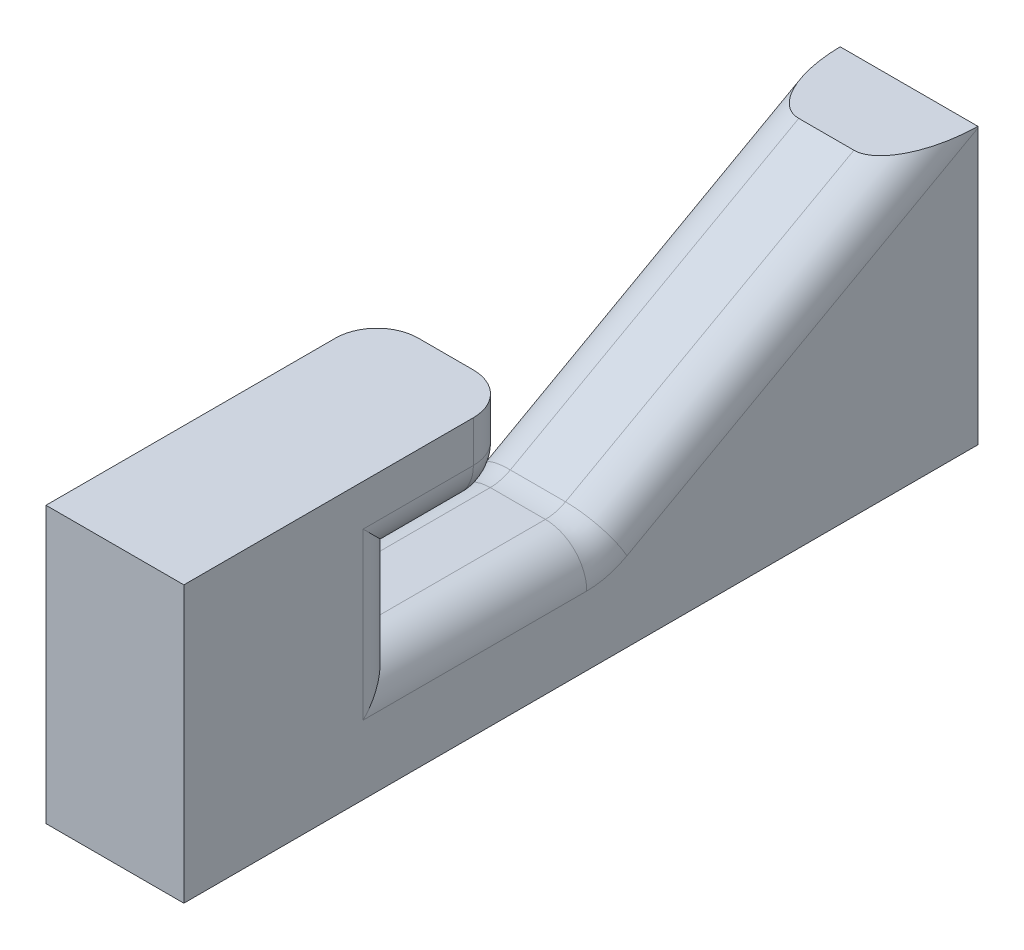
ISO-10303-21;
HEADER;
FILE_DESCRIPTION(('STEP AP214'),'2;1');
FILE_NAME('part.step','',(''),(''),'','','');
FILE_SCHEMA(('AUTOMOTIVE_DESIGN { 1 0 10303 214 1 1 1 1 }'));
ENDSEC;
DATA;
#1=APPLICATION_CONTEXT('core data for automotive mechanical design processes');
#2=APPLICATION_PROTOCOL_DEFINITION('international standard','automotive_design',2000,#1);
#3=PRODUCT_CONTEXT('',#1,'mechanical');
#4=PRODUCT('Part','Part','',(#3));
#5=PRODUCT_RELATED_PRODUCT_CATEGORY('part','',(#4));
#6=PRODUCT_DEFINITION_FORMATION('','',#4);
#7=PRODUCT_DEFINITION_CONTEXT('part definition',#1,'design');
#8=PRODUCT_DEFINITION('design','',#6,#7);
#9=PRODUCT_DEFINITION_SHAPE('','',#8);
#10=(LENGTH_UNIT() NAMED_UNIT(*) SI_UNIT(.MILLI.,.METRE.));
#11=(NAMED_UNIT(*) PLANE_ANGLE_UNIT() SI_UNIT($,.RADIAN.));
#12=(NAMED_UNIT(*) SI_UNIT($,.STERADIAN.) SOLID_ANGLE_UNIT());
#13=UNCERTAINTY_MEASURE_WITH_UNIT(LENGTH_MEASURE(1.E-05),#10,'distance_accuracy_value','');
#14=(GEOMETRIC_REPRESENTATION_CONTEXT(3) GLOBAL_UNCERTAINTY_ASSIGNED_CONTEXT((#13)) GLOBAL_UNIT_ASSIGNED_CONTEXT((#10,
#11,#12)) REPRESENTATION_CONTEXT('',''));
#15=CARTESIAN_POINT('',(0.,0.,0.));
#16=DIRECTION('',(0.,0.,1.));
#17=DIRECTION('',(1.,0.,0.));
#18=AXIS2_PLACEMENT_3D('',#15,#16,#17);
#19=CARTESIAN_POINT('',(5.,10.,0.));
#20=DIRECTION('',(0.,-1.,0.));
#21=DIRECTION('',(0.,0.,-1.));
#22=AXIS2_PLACEMENT_3D('',#19,#20,#21);
#23=PLANE('',#22);
#24=DIRECTION('',(1.,0.,0.));
#25=VECTOR('',#24,1.);
#26=CARTESIAN_POINT('',(0.,10.,16.8));
#27=LINE('',#26,#25);
#28=CARTESIAN_POINT('',(1.5,10.,16.8));
#29=VERTEX_POINT('',#28);
#30=CARTESIAN_POINT('',(3.5,10.,16.8));
#31=VERTEX_POINT('',#30);
#32=EDGE_CURVE('E317',#29,#31,#27,.T.);
#33=ORIENTED_EDGE('',*,*,#32,.F.);
#34=CARTESIAN_POINT('',(1.5,10.,18.3));
#35=DIRECTION('',(0.,-1.,0.));
#36=DIRECTION('',(0.,0.,-1.));
#37=AXIS2_PLACEMENT_3D('',#34,#35,#36);
#38=CIRCLE('',#37,1.5);
#39=CARTESIAN_POINT('',(0.,10.,18.3));
#40=VERTEX_POINT('',#39);
#41=EDGE_CURVE('E252',#29,#40,#38,.F.);
#42=ORIENTED_EDGE('',*,*,#41,.T.);
#43=DIRECTION('',(0.,0.,1.));
#44=VECTOR('',#43,1.);
#45=CARTESIAN_POINT('',(0.,10.,0.));
#46=LINE('',#45,#44);
#47=CARTESIAN_POINT('',(0.,10.,28.8));
#48=VERTEX_POINT('',#47);
#49=EDGE_CURVE('E334',#40,#48,#46,.T.);
#50=ORIENTED_EDGE('',*,*,#49,.T.);
#51=DIRECTION('',(-1.,0.,0.));
#52=VECTOR('',#51,1.);
#53=CARTESIAN_POINT('',(5.,10.,28.8));
#54=LINE('',#53,#52);
#55=CARTESIAN_POINT('',(5.,10.,28.8));
#56=VERTEX_POINT('',#55);
#57=EDGE_CURVE('E203',#56,#48,#54,.T.);
#58=ORIENTED_EDGE('',*,*,#57,.F.);
#59=DIRECTION('',(0.,0.,1.));
#60=VECTOR('',#59,1.);
#61=CARTESIAN_POINT('',(5.,10.,0.));
#62=LINE('',#61,#60);
#63=CARTESIAN_POINT('',(5.,10.,18.3));
#64=VERTEX_POINT('',#63);
#65=EDGE_CURVE('E182',#64,#56,#62,.T.);
#66=ORIENTED_EDGE('',*,*,#65,.F.);
#67=CARTESIAN_POINT('',(3.5,10.,18.3));
#68=DIRECTION('',(0.,-1.,0.));
#69=DIRECTION('',(0.,0.,-1.));
#70=AXIS2_PLACEMENT_3D('',#67,#68,#69);
#71=CIRCLE('',#70,1.5);
#72=EDGE_CURVE('E250',#64,#31,#71,.F.);
#73=ORIENTED_EDGE('',*,*,#72,.T.);
#74=EDGE_LOOP('',(#33,#42,#50,#58,#66,#73));
#75=FACE_BOUND('',#74,.T.);
#76=ADVANCED_FACE('F39',(#75),#23,.F.);
#77=CARTESIAN_POINT('',(5.,0.,0.));
#78=DIRECTION('',(0.,1.,0.));
#79=DIRECTION('',(0.,0.,1.));
#80=AXIS2_PLACEMENT_3D('',#77,#78,#79);
#81=PLANE('',#80);
#82=DIRECTION('',(0.,0.,-1.));
#83=VECTOR('',#82,1.);
#84=CARTESIAN_POINT('',(0.,0.,0.));
#85=LINE('',#84,#83);
#86=CARTESIAN_POINT('',(0.,0.,28.8));
#87=VERTEX_POINT('',#86);
#88=CARTESIAN_POINT('',(0.,0.,0.));
#89=VERTEX_POINT('',#88);
#90=EDGE_CURVE('E196',#87,#89,#85,.T.);
#91=ORIENTED_EDGE('',*,*,#90,.T.);
#92=DIRECTION('',(-1.,0.,0.));
#93=VECTOR('',#92,1.);
#94=CARTESIAN_POINT('',(5.,0.,0.));
#95=LINE('',#94,#93);
#96=CARTESIAN_POINT('',(5.,0.,0.));
#97=VERTEX_POINT('',#96);
#98=EDGE_CURVE('E175',#97,#89,#95,.T.);
#99=ORIENTED_EDGE('',*,*,#98,.F.);
#100=DIRECTION('',(0.,0.,-1.));
#101=VECTOR('',#100,1.);
#102=CARTESIAN_POINT('',(5.,0.,0.));
#103=LINE('',#102,#101);
#104=CARTESIAN_POINT('',(5.,0.,28.8));
#105=VERTEX_POINT('',#104);
#106=EDGE_CURVE('E183',#105,#97,#103,.T.);
#107=ORIENTED_EDGE('',*,*,#106,.F.);
#108=DIRECTION('',(-1.,0.,0.));
#109=VECTOR('',#108,1.);
#110=CARTESIAN_POINT('',(5.,0.,28.8));
#111=LINE('',#110,#109);
#112=EDGE_CURVE('E329',#105,#87,#111,.T.);
#113=ORIENTED_EDGE('',*,*,#112,.T.);
#114=EDGE_LOOP('',(#91,#99,#107,#113));
#115=FACE_BOUND('',#114,.T.);
#116=ADVANCED_FACE('F194',(#115),#81,.F.);
#117=CARTESIAN_POINT('',(5.,0.,0.));
#118=DIRECTION('',(0.,0.,1.));
#119=DIRECTION('',(1.,0.,0.));
#120=AXIS2_PLACEMENT_3D('',#117,#118,#119);
#121=PLANE('',#120);
#122=DIRECTION('',(0.,1.,0.));
#123=VECTOR('',#122,1.);
#124=CARTESIAN_POINT('',(0.,0.,0.));
#125=LINE('',#124,#123);
#126=CARTESIAN_POINT('',(0.,9.9507283098355,0.));
#127=VERTEX_POINT('',#126);
#128=EDGE_CURVE('E331',#89,#127,#125,.T.);
#129=ORIENTED_EDGE('',*,*,#128,.T.);
#130=CARTESIAN_POINT('',(1.5,9.9507283098355,0.));
#131=DIRECTION('',(0.,0.,1.));
#132=DIRECTION('',(0.,-1.,0.));
#133=AXIS2_PLACEMENT_3D('',#130,#131,#132);
#134=ELLIPSE('',#133,1.71593835683117,1.5);
#135=CARTESIAN_POINT('',(0.000618503791071333,10.,0.));
#136=VERTEX_POINT('',#135);
#137=EDGE_CURVE('E219',#127,#136,#134,.F.);
#138=ORIENTED_EDGE('',*,*,#137,.T.);
#139=DIRECTION('',(-1.,0.,0.));
#140=VECTOR('',#139,1.);
#141=CARTESIAN_POINT('',(5.,10.,0.));
#142=LINE('',#141,#140);
#143=CARTESIAN_POINT('',(4.99938149620893,10.,0.));
#144=VERTEX_POINT('',#143);
#145=EDGE_CURVE('E198',#144,#136,#142,.T.);
#146=ORIENTED_EDGE('',*,*,#145,.F.);
#147=CARTESIAN_POINT('',(3.5,9.9507283098355,0.));
#148=DIRECTION('',(0.,0.,1.));
#149=DIRECTION('',(0.,1.,0.));
#150=AXIS2_PLACEMENT_3D('',#147,#148,#149);
#151=ELLIPSE('',#150,1.71593835683117,1.5);
#152=CARTESIAN_POINT('',(5.,9.9507283098355,0.));
#153=VERTEX_POINT('',#152);
#154=EDGE_CURVE('E179',#144,#153,#151,.F.);
#155=ORIENTED_EDGE('',*,*,#154,.T.);
#156=DIRECTION('',(0.,1.,0.));
#157=VECTOR('',#156,1.);
#158=CARTESIAN_POINT('',(5.,0.,0.));
#159=LINE('',#158,#157);
#160=EDGE_CURVE('E170',#97,#153,#159,.T.);
#161=ORIENTED_EDGE('',*,*,#160,.F.);
#162=ORIENTED_EDGE('',*,*,#98,.T.);
#163=EDGE_LOOP('',(#129,#138,#146,#155,#161,#162));
#164=FACE_BOUND('',#163,.T.);
#165=ADVANCED_FACE('F173',(#164),#121,.F.);
#166=ORIENTED_EDGE('',*,*,#145,.T.);
#167=CARTESIAN_POINT('',(1.5,10.,-0.0886890422960966));
#168=DIRECTION('',(0.,-1.,0.));
#169=DIRECTION('',(0.,0.,1.));
#170=AXIS2_PLACEMENT_3D('',#167,#168,#169);
#171=ELLIPSE('',#170,3.0886890422961,1.5);
#172=CARTESIAN_POINT('',(1.5,10.,3.));
#173=VERTEX_POINT('',#172);
#174=EDGE_CURVE('E223',#136,#173,#171,.F.);
#175=ORIENTED_EDGE('',*,*,#174,.T.);
#176=DIRECTION('',(1.,0.,0.));
#177=VECTOR('',#176,1.);
#178=CARTESIAN_POINT('',(0.,10.,3.));
#179=LINE('',#178,#177);
#180=CARTESIAN_POINT('',(3.5,10.,3.));
#181=VERTEX_POINT('',#180);
#182=EDGE_CURVE('E312',#173,#181,#179,.T.);
#183=ORIENTED_EDGE('',*,*,#182,.T.);
#184=CARTESIAN_POINT('',(3.5,10.,-0.0886890422960966));
#185=DIRECTION('',(0.,-1.,0.));
#186=DIRECTION('',(0.,0.,-1.));
#187=AXIS2_PLACEMENT_3D('',#184,#185,#186);
#188=ELLIPSE('',#187,3.0886890422961,1.5);
#189=EDGE_CURVE('E221',#181,#144,#188,.F.);
#190=ORIENTED_EDGE('',*,*,#189,.T.);
#191=EDGE_LOOP('',(#166,#175,#183,#190));
#192=FACE_BOUND('',#191,.T.);
#193=ADVANCED_FACE('F351',(#192),#23,.F.);
#194=CARTESIAN_POINT('',(5.,0.,28.8));
#195=DIRECTION('',(0.,0.,-1.));
#196=DIRECTION('',(-1.,0.,0.));
#197=AXIS2_PLACEMENT_3D('',#194,#195,#196);
#198=PLANE('',#197);
#199=DIRECTION('',(0.,-1.,0.));
#200=VECTOR('',#199,1.);
#201=CARTESIAN_POINT('',(0.,0.,28.8));
#202=LINE('',#201,#200);
#203=EDGE_CURVE('E192',#48,#87,#202,.T.);
#204=ORIENTED_EDGE('',*,*,#203,.T.);
#205=ORIENTED_EDGE('',*,*,#112,.F.);
#206=DIRECTION('',(0.,-1.,0.));
#207=VECTOR('',#206,1.);
#208=CARTESIAN_POINT('',(5.,0.,28.8));
#209=LINE('',#208,#207);
#210=EDGE_CURVE('E188',#56,#105,#209,.T.);
#211=ORIENTED_EDGE('',*,*,#210,.F.);
#212=ORIENTED_EDGE('',*,*,#57,.T.);
#213=EDGE_LOOP('',(#204,#205,#211,#212));
#214=FACE_BOUND('',#213,.T.);
#215=ADVANCED_FACE('F341',(#214),#198,.F.);
#216=CARTESIAN_POINT('',(5.,0.,0.));
#217=DIRECTION('',(-1.,0.,0.));
#218=DIRECTION('',(0.,0.,1.));
#219=AXIS2_PLACEMENT_3D('',#216,#217,#218);
#220=PLANE('',#219);
#221=ORIENTED_EDGE('',*,*,#160,.T.);
#222=DIRECTION('',(0.,0.485642931178632,-0.874157276121538));
#223=VECTOR('',#222,1.);
#224=CARTESIAN_POINT('',(5.,7.60385842544034,4.2243657919113));
#225=LINE('',#224,#223);
#226=CARTESIAN_POINT('',(5.,2.87752817163538,12.7317602487602));
#227=VERTEX_POINT('',#226);
#228=EDGE_CURVE('E242',#153,#227,#225,.F.);
#229=ORIENTED_EDGE('',*,*,#228,.T.);
#230=CARTESIAN_POINT('',(5.,5.5,14.1886890422961));
#231=DIRECTION('',(-1.,0.,0.));
#232=DIRECTION('',(0.,0.,1.));
#233=AXIS2_PLACEMENT_3D('',#230,#231,#232);
#234=CIRCLE('',#233,3.);
#235=CARTESIAN_POINT('',(5.,2.5,14.1886890422961));
#236=VERTEX_POINT('',#235);
#237=EDGE_CURVE('E239',#236,#227,#234,.F.);
#238=ORIENTED_EDGE('',*,*,#237,.F.);
#239=DIRECTION('',(0.,0.,1.));
#240=VECTOR('',#239,1.);
#241=CARTESIAN_POINT('',(5.,2.5,20.8));
#242=LINE('',#241,#240);
#243=CARTESIAN_POINT('',(5.,2.5,22.3));
#244=VERTEX_POINT('',#243);
#245=EDGE_CURVE('E233',#236,#244,#242,.T.);
#246=ORIENTED_EDGE('',*,*,#245,.T.);
#247=DIRECTION('',(0.,-1.,0.));
#248=VECTOR('',#247,1.);
#249=CARTESIAN_POINT('',(5.,0.,22.3));
#250=LINE('',#249,#248);
#251=CARTESIAN_POINT('',(5.,8.5,22.3));
#252=VERTEX_POINT('',#251);
#253=EDGE_CURVE('E231',#244,#252,#250,.F.);
#254=ORIENTED_EDGE('',*,*,#253,.T.);
#255=DIRECTION('',(0.,0.,-1.));
#256=VECTOR('',#255,1.);
#257=CARTESIAN_POINT('',(5.,8.5,16.8));
#258=LINE('',#257,#256);
#259=CARTESIAN_POINT('',(5.,8.5,18.3));
#260=VERTEX_POINT('',#259);
#261=EDGE_CURVE('E235',#252,#260,#258,.T.);
#262=ORIENTED_EDGE('',*,*,#261,.T.);
#263=DIRECTION('',(0.,-1.,0.));
#264=VECTOR('',#263,1.);
#265=CARTESIAN_POINT('',(5.,0.,18.3));
#266=LINE('',#265,#264);
#267=EDGE_CURVE('E237',#260,#64,#266,.F.);
#268=ORIENTED_EDGE('',*,*,#267,.T.);
#269=ORIENTED_EDGE('',*,*,#65,.T.);
#270=ORIENTED_EDGE('',*,*,#210,.T.);
#271=ORIENTED_EDGE('',*,*,#106,.T.);
#272=EDGE_LOOP('',(#221,#229,#238,#246,#254,#262,#268,#269,#270,#271));
#273=FACE_BOUND('',#272,.T.);
#274=ADVANCED_FACE('F186',(#273),#220,.F.);
#275=CARTESIAN_POINT('',(0.,0.,0.));
#276=DIRECTION('',(-1.,0.,0.));
#277=DIRECTION('',(0.,0.,1.));
#278=AXIS2_PLACEMENT_3D('',#275,#276,#277);
#279=PLANE('',#278);
#280=CARTESIAN_POINT('',(0.,5.5,14.1886890422961));
#281=DIRECTION('',(-1.,0.,0.));
#282=DIRECTION('',(0.,0.,1.));
#283=AXIS2_PLACEMENT_3D('',#280,#281,#282);
#284=CIRCLE('',#283,3.);
#285=CARTESIAN_POINT('',(0.,2.87752817163538,12.7317602487602));
#286=VERTEX_POINT('',#285);
#287=CARTESIAN_POINT('',(0.,2.5,14.1886890422961));
#288=VERTEX_POINT('',#287);
#289=EDGE_CURVE('E212',#286,#288,#284,.T.);
#290=ORIENTED_EDGE('',*,*,#289,.F.);
#291=DIRECTION('',(0.,0.485642931178632,-0.874157276121538));
#292=VECTOR('',#291,1.);
#293=CARTESIAN_POINT('',(0.,8.68876408581769,2.27153560323206));
#294=LINE('',#293,#292);
#295=EDGE_CURVE('E215',#286,#127,#294,.T.);
#296=ORIENTED_EDGE('',*,*,#295,.T.);
#297=ORIENTED_EDGE('',*,*,#128,.F.);
#298=ORIENTED_EDGE('',*,*,#90,.F.);
#299=ORIENTED_EDGE('',*,*,#203,.F.);
#300=ORIENTED_EDGE('',*,*,#49,.F.);
#301=DIRECTION('',(0.,-1.,0.));
#302=VECTOR('',#301,1.);
#303=CARTESIAN_POINT('',(0.,7.,18.3));
#304=LINE('',#303,#302);
#305=CARTESIAN_POINT('',(0.,8.5,18.3));
#306=VERTEX_POINT('',#305);
#307=EDGE_CURVE('E210',#40,#306,#304,.T.);
#308=ORIENTED_EDGE('',*,*,#307,.T.);
#309=DIRECTION('',(0.,0.,-1.));
#310=VECTOR('',#309,1.);
#311=CARTESIAN_POINT('',(0.,8.5,0.));
#312=LINE('',#311,#310);
#313=CARTESIAN_POINT('',(0.,8.5,22.3));
#314=VERTEX_POINT('',#313);
#315=EDGE_CURVE('E197',#306,#314,#312,.F.);
#316=ORIENTED_EDGE('',*,*,#315,.T.);
#317=DIRECTION('',(0.,-1.,0.));
#318=VECTOR('',#317,1.);
#319=CARTESIAN_POINT('',(0.,4.,22.3));
#320=LINE('',#319,#318);
#321=CARTESIAN_POINT('',(0.,2.5,22.3));
#322=VERTEX_POINT('',#321);
#323=EDGE_CURVE('E200',#314,#322,#320,.T.);
#324=ORIENTED_EDGE('',*,*,#323,.T.);
#325=DIRECTION('',(0.,0.,1.));
#326=VECTOR('',#325,1.);
#327=CARTESIAN_POINT('',(0.,2.5,0.));
#328=LINE('',#327,#326);
#329=EDGE_CURVE('E208',#322,#288,#328,.F.);
#330=ORIENTED_EDGE('',*,*,#329,.T.);
#331=EDGE_LOOP('',(#290,#296,#297,#298,#299,#300,#308,#316,#324,#330));
#332=FACE_BOUND('',#331,.T.);
#333=ADVANCED_FACE('F346',(#332),#279,.T.);
#334=CARTESIAN_POINT('',(0.,4.,0.));
#335=DIRECTION('',(0.,1.,0.));
#336=DIRECTION('',(0.,0.,1.));
#337=AXIS2_PLACEMENT_3D('',#334,#335,#336);
#338=PLANE('',#337);
#339=DIRECTION('',(1.,0.,0.));
#340=VECTOR('',#339,1.);
#341=CARTESIAN_POINT('',(0.,4.,20.8));
#342=LINE('',#341,#340);
#343=CARTESIAN_POINT('',(1.5,4.,20.8));
#344=VERTEX_POINT('',#343);
#345=CARTESIAN_POINT('',(3.5,4.,20.8));
#346=VERTEX_POINT('',#345);
#347=EDGE_CURVE('E332',#344,#346,#342,.T.);
#348=ORIENTED_EDGE('',*,*,#347,.T.);
#349=DIRECTION('',(0.,0.,1.));
#350=VECTOR('',#349,1.);
#351=CARTESIAN_POINT('',(3.5,4.,13.8));
#352=LINE('',#351,#350);
#353=CARTESIAN_POINT('',(3.5,4.,14.1886890422961));
#354=VERTEX_POINT('',#353);
#355=EDGE_CURVE('E259',#346,#354,#352,.F.);
#356=ORIENTED_EDGE('',*,*,#355,.T.);
#357=DIRECTION('',(1.,0.,0.));
#358=VECTOR('',#357,1.);
#359=CARTESIAN_POINT('',(0.,4.,14.1886890422961));
#360=LINE('',#359,#358);
#361=CARTESIAN_POINT('',(1.5,4.,14.1886890422961));
#362=VERTEX_POINT('',#361);
#363=EDGE_CURVE('E256',#354,#362,#360,.F.);
#364=ORIENTED_EDGE('',*,*,#363,.T.);
#365=DIRECTION('',(0.,0.,1.));
#366=VECTOR('',#365,1.);
#367=CARTESIAN_POINT('',(1.5,4.,0.));
#368=LINE('',#367,#366);
#369=EDGE_CURVE('E254',#362,#344,#368,.T.);
#370=ORIENTED_EDGE('',*,*,#369,.T.);
#371=EDGE_LOOP('',(#348,#356,#364,#370));
#372=FACE_BOUND('',#371,.T.);
#373=ADVANCED_FACE('F375',(#372),#338,.T.);
#374=CARTESIAN_POINT('',(0.,0.,20.8));
#375=DIRECTION('',(0.,0.,1.));
#376=DIRECTION('',(1.,0.,0.));
#377=AXIS2_PLACEMENT_3D('',#374,#375,#376);
#378=PLANE('',#377);
#379=DIRECTION('',(1.,0.,0.));
#380=VECTOR('',#379,1.);
#381=CARTESIAN_POINT('',(0.,7.,20.8));
#382=LINE('',#381,#380);
#383=CARTESIAN_POINT('',(1.5,7.,20.8));
#384=VERTEX_POINT('',#383);
#385=CARTESIAN_POINT('',(3.5,7.,20.8));
#386=VERTEX_POINT('',#385);
#387=EDGE_CURVE('E323',#384,#386,#382,.T.);
#388=ORIENTED_EDGE('',*,*,#387,.T.);
#389=DIRECTION('',(0.,-1.,0.));
#390=VECTOR('',#389,1.);
#391=CARTESIAN_POINT('',(3.5,0.,20.8));
#392=LINE('',#391,#390);
#393=EDGE_CURVE('E11',#386,#346,#392,.T.);
#394=ORIENTED_EDGE('',*,*,#393,.T.);
#395=ORIENTED_EDGE('',*,*,#347,.F.);
#396=DIRECTION('',(0.,-1.,0.));
#397=VECTOR('',#396,1.);
#398=CARTESIAN_POINT('',(1.5,7.,20.8));
#399=LINE('',#398,#397);
#400=EDGE_CURVE('E48',#344,#384,#399,.F.);
#401=ORIENTED_EDGE('',*,*,#400,.T.);
#402=EDGE_LOOP('',(#388,#394,#395,#401));
#403=FACE_BOUND('',#402,.T.);
#404=ADVANCED_FACE('F422',(#403),#378,.F.);
#405=CARTESIAN_POINT('',(0.,7.,0.));
#406=DIRECTION('',(0.,-1.,0.));
#407=DIRECTION('',(0.,0.,-1.));
#408=AXIS2_PLACEMENT_3D('',#405,#406,#407);
#409=PLANE('',#408);
#410=DIRECTION('',(1.,0.,0.));
#411=VECTOR('',#410,1.);
#412=CARTESIAN_POINT('',(5.,7.,18.3));
#413=LINE('',#412,#411);
#414=CARTESIAN_POINT('',(1.5,7.,18.3));
#415=VERTEX_POINT('',#414);
#416=CARTESIAN_POINT('',(3.5,7.,18.3));
#417=VERTEX_POINT('',#416);
#418=EDGE_CURVE('E56',#415,#417,#413,.T.);
#419=ORIENTED_EDGE('',*,*,#418,.T.);
#420=DIRECTION('',(0.,0.,-1.));
#421=VECTOR('',#420,1.);
#422=CARTESIAN_POINT('',(3.5,7.,20.8));
#423=LINE('',#422,#421);
#424=EDGE_CURVE('E263',#417,#386,#423,.F.);
#425=ORIENTED_EDGE('',*,*,#424,.T.);
#426=ORIENTED_EDGE('',*,*,#387,.F.);
#427=DIRECTION('',(0.,0.,-1.));
#428=VECTOR('',#427,1.);
#429=CARTESIAN_POINT('',(1.5,7.,0.));
#430=LINE('',#429,#428);
#431=EDGE_CURVE('E61',#384,#415,#430,.T.);
#432=ORIENTED_EDGE('',*,*,#431,.T.);
#433=EDGE_LOOP('',(#419,#425,#426,#432));
#434=FACE_BOUND('',#433,.T.);
#435=ADVANCED_FACE('F423',(#434),#409,.T.);
#436=CARTESIAN_POINT('',(0.,0.,16.8));
#437=DIRECTION('',(0.,0.,1.));
#438=DIRECTION('',(0.,-1.,0.));
#439=AXIS2_PLACEMENT_3D('',#436,#437,#438);
#440=PLANE('',#439);
#441=DIRECTION('',(1.,0.,0.));
#442=VECTOR('',#441,1.);
#443=CARTESIAN_POINT('',(0.,8.5,16.8));
#444=LINE('',#443,#442);
#445=CARTESIAN_POINT('',(3.5,8.5,16.8));
#446=VERTEX_POINT('',#445);
#447=CARTESIAN_POINT('',(1.5,8.5,16.8));
#448=VERTEX_POINT('',#447);
#449=EDGE_CURVE('E244',#446,#448,#444,.F.);
#450=ORIENTED_EDGE('',*,*,#449,.T.);
#451=DIRECTION('',(0.,-1.,0.));
#452=VECTOR('',#451,1.);
#453=CARTESIAN_POINT('',(1.5,10.,16.8));
#454=LINE('',#453,#452);
#455=EDGE_CURVE('E248',#448,#29,#454,.F.);
#456=ORIENTED_EDGE('',*,*,#455,.T.);
#457=ORIENTED_EDGE('',*,*,#32,.T.);
#458=DIRECTION('',(0.,-1.,0.));
#459=VECTOR('',#458,1.);
#460=CARTESIAN_POINT('',(3.5,0.,16.8));
#461=LINE('',#460,#459);
#462=EDGE_CURVE('E246',#31,#446,#461,.T.);
#463=ORIENTED_EDGE('',*,*,#462,.T.);
#464=EDGE_LOOP('',(#450,#456,#457,#463));
#465=FACE_BOUND('',#464,.T.);
#466=ADVANCED_FACE('F400',(#465),#440,.F.);
#467=CARTESIAN_POINT('',(0.,8.91509433962264,4.95283018867925));
#468=DIRECTION('',(0.,-0.874157276121538,-0.485642931178632));
#469=DIRECTION('',(0.,0.485642931178632,-0.874157276121538));
#470=AXIS2_PLACEMENT_3D('',#467,#468,#469);
#471=PLANE('',#470);
#472=ORIENTED_EDGE('',*,*,#182,.F.);
#473=DIRECTION('',(0.,0.485642931178632,-0.874157276121538));
#474=VECTOR('',#473,1.);
#475=CARTESIAN_POINT('',(1.5,4.,13.8));
#476=LINE('',#475,#474);
#477=CARTESIAN_POINT('',(1.5,4.18876408581769,13.4602246455282));
#478=VERTEX_POINT('',#477);
#479=EDGE_CURVE('E229',#173,#478,#476,.F.);
#480=ORIENTED_EDGE('',*,*,#479,.T.);
#481=DIRECTION('',(1.,0.,0.));
#482=VECTOR('',#481,1.);
#483=CARTESIAN_POINT('',(0.,4.18876408581769,13.4602246455282));
#484=LINE('',#483,#482);
#485=CARTESIAN_POINT('',(3.5,4.18876408581769,13.4602246455282));
#486=VERTEX_POINT('',#485);
#487=EDGE_CURVE('E225',#478,#486,#484,.T.);
#488=ORIENTED_EDGE('',*,*,#487,.T.);
#489=DIRECTION('',(0.,0.485642931178632,-0.874157276121538));
#490=VECTOR('',#489,1.);
#491=CARTESIAN_POINT('',(3.5,8.91509433962264,4.95283018867925));
#492=LINE('',#491,#490);
#493=EDGE_CURVE('E227',#486,#181,#492,.T.);
#494=ORIENTED_EDGE('',*,*,#493,.T.);
#495=EDGE_LOOP('',(#472,#480,#488,#494));
#496=FACE_BOUND('',#495,.T.);
#497=ADVANCED_FACE('F357',(#496),#471,.F.);
#498=CARTESIAN_POINT('',(3.5,0.,18.3));
#499=DIRECTION('',(0.,-1.,0.));
#500=DIRECTION('',(0.,0.,-1.));
#501=AXIS2_PLACEMENT_3D('',#498,#499,#500);
#502=CYLINDRICAL_SURFACE('',#501,1.5);
#503=CARTESIAN_POINT('',(3.5,8.5,18.3));
#504=DIRECTION('',(0.,-1.,0.));
#505=DIRECTION('',(0.,0.,-1.));
#506=AXIS2_PLACEMENT_3D('',#503,#504,#505);
#507=CIRCLE('',#506,1.5);
#508=EDGE_CURVE('E43',#446,#260,#507,.T.);
#509=ORIENTED_EDGE('',*,*,#508,.F.);
#510=ORIENTED_EDGE('',*,*,#462,.F.);
#511=ORIENTED_EDGE('',*,*,#72,.F.);
#512=ORIENTED_EDGE('',*,*,#267,.F.);
#513=EDGE_LOOP('',(#509,#510,#511,#512));
#514=FACE_BOUND('',#513,.T.);
#515=ADVANCED_FACE('F41',(#514),#502,.T.);
#516=CARTESIAN_POINT('',(3.5,8.5,18.3));
#517=DIRECTION('',(1.,0.,0.));
#518=DIRECTION('',(0.,0.,-1.));
#519=AXIS2_PLACEMENT_3D('',#516,#517,#518);
#520=SPHERICAL_SURFACE('',#519,1.5);
#521=CARTESIAN_POINT('',(3.5,8.5,18.3));
#522=DIRECTION('',(1.,0.,0.));
#523=DIRECTION('',(0.,0.,-1.));
#524=AXIS2_PLACEMENT_3D('',#521,#522,#523);
#525=CIRCLE('',#524,1.5);
#526=EDGE_CURVE('E304',#446,#417,#525,.F.);
#527=ORIENTED_EDGE('',*,*,#526,.F.);
#528=ORIENTED_EDGE('',*,*,#508,.T.);
#529=CARTESIAN_POINT('',(3.5,8.5,18.3));
#530=DIRECTION('',(0.,0.,-1.));
#531=DIRECTION('',(-1.,0.,0.));
#532=AXIS2_PLACEMENT_3D('',#529,#530,#531);
#533=CIRCLE('',#532,1.5);
#534=EDGE_CURVE('E305',#417,#260,#533,.F.);
#535=ORIENTED_EDGE('',*,*,#534,.F.);
#536=EDGE_LOOP('',(#527,#528,#535));
#537=FACE_BOUND('',#536,.T.);
#538=ADVANCED_FACE('F477',(#537),#520,.T.);
#539=CARTESIAN_POINT('',(3.5,8.5,0.));
#540=DIRECTION('',(0.,0.,1.));
#541=DIRECTION('',(0.,-1.,0.));
#542=AXIS2_PLACEMENT_3D('',#539,#540,#541);
#543=CYLINDRICAL_SURFACE('',#542,1.5);
#544=ORIENTED_EDGE('',*,*,#534,.T.);
#545=ORIENTED_EDGE('',*,*,#261,.F.);
#546=CARTESIAN_POINT('',(3.5,8.5,22.3));
#547=DIRECTION('',(0.,-0.707106781186547,0.707106781186547));
#548=DIRECTION('',(0.,0.707106781186547,0.707106781186548));
#549=AXIS2_PLACEMENT_3D('',#546,#547,#548);
#550=ELLIPSE('',#549,2.12132034355964,1.5);
#551=EDGE_CURVE('E301',#386,#252,#550,.T.);
#552=ORIENTED_EDGE('',*,*,#551,.F.);
#553=ORIENTED_EDGE('',*,*,#424,.F.);
#554=EDGE_LOOP('',(#544,#545,#552,#553));
#555=FACE_BOUND('',#554,.T.);
#556=ADVANCED_FACE('F392',(#555),#543,.T.);
#557=CARTESIAN_POINT('',(0.,8.5,18.3));
#558=DIRECTION('',(-1.,0.,0.));
#559=DIRECTION('',(0.,0.,1.));
#560=AXIS2_PLACEMENT_3D('',#557,#558,#559);
#561=CYLINDRICAL_SURFACE('',#560,1.5);
#562=ORIENTED_EDGE('',*,*,#526,.T.);
#563=ORIENTED_EDGE('',*,*,#418,.F.);
#564=CARTESIAN_POINT('',(1.5,8.5,18.3));
#565=DIRECTION('',(-1.,0.,0.));
#566=DIRECTION('',(0.,0.,1.));
#567=AXIS2_PLACEMENT_3D('',#564,#565,#566);
#568=CIRCLE('',#567,1.5);
#569=EDGE_CURVE('E298',#448,#415,#568,.T.);
#570=ORIENTED_EDGE('',*,*,#569,.F.);
#571=ORIENTED_EDGE('',*,*,#449,.F.);
#572=EDGE_LOOP('',(#562,#563,#570,#571));
#573=FACE_BOUND('',#572,.T.);
#574=ADVANCED_FACE('F409',(#573),#561,.T.);
#575=CARTESIAN_POINT('',(1.5,0.,18.3));
#576=DIRECTION('',(0.,1.,0.));
#577=DIRECTION('',(0.,0.,1.));
#578=AXIS2_PLACEMENT_3D('',#575,#576,#577);
#579=CYLINDRICAL_SURFACE('',#578,1.5);
#580=ORIENTED_EDGE('',*,*,#41,.F.);
#581=ORIENTED_EDGE('',*,*,#455,.F.);
#582=CARTESIAN_POINT('',(1.5,8.5,18.3));
#583=DIRECTION('',(0.,-1.,0.));
#584=DIRECTION('',(0.,0.,-1.));
#585=AXIS2_PLACEMENT_3D('',#582,#583,#584);
#586=CIRCLE('',#585,1.5);
#587=EDGE_CURVE('E295',#306,#448,#586,.T.);
#588=ORIENTED_EDGE('',*,*,#587,.F.);
#589=ORIENTED_EDGE('',*,*,#307,.F.);
#590=EDGE_LOOP('',(#580,#581,#588,#589));
#591=FACE_BOUND('',#590,.T.);
#592=ADVANCED_FACE('F406',(#591),#579,.T.);
#593=CARTESIAN_POINT('',(3.5,0.,22.3));
#594=DIRECTION('',(0.,-1.,0.));
#595=DIRECTION('',(0.,0.,-1.));
#596=AXIS2_PLACEMENT_3D('',#593,#594,#595);
#597=CYLINDRICAL_SURFACE('',#596,1.5);
#598=ORIENTED_EDGE('',*,*,#551,.T.);
#599=ORIENTED_EDGE('',*,*,#253,.F.);
#600=CARTESIAN_POINT('',(3.5,2.5,22.3));
#601=DIRECTION('',(0.,-0.707106781186548,-0.707106781186547));
#602=DIRECTION('',(0.,0.707106781186547,-0.707106781186548));
#603=AXIS2_PLACEMENT_3D('',#600,#601,#602);
#604=ELLIPSE('',#603,2.12132034355964,1.5);
#605=EDGE_CURVE('E292',#346,#244,#604,.T.);
#606=ORIENTED_EDGE('',*,*,#605,.F.);
#607=ORIENTED_EDGE('',*,*,#393,.F.);
#608=EDGE_LOOP('',(#598,#599,#606,#607));
#609=FACE_BOUND('',#608,.T.);
#610=ADVANCED_FACE('F389',(#609),#597,.T.);
#611=CARTESIAN_POINT('',(1.5,8.5,18.3));
#612=DIRECTION('',(0.,0.,-1.));
#613=DIRECTION('',(0.,1.,0.));
#614=AXIS2_PLACEMENT_3D('',#611,#612,#613);
#615=SPHERICAL_SURFACE('',#614,1.5);
#616=ORIENTED_EDGE('',*,*,#587,.T.);
#617=ORIENTED_EDGE('',*,*,#569,.T.);
#618=CARTESIAN_POINT('',(1.5,8.5,18.3));
#619=DIRECTION('',(0.,0.,-1.));
#620=DIRECTION('',(-1.,0.,0.));
#621=AXIS2_PLACEMENT_3D('',#618,#619,#620);
#622=CIRCLE('',#621,1.5);
#623=EDGE_CURVE('E289',#306,#415,#622,.F.);
#624=ORIENTED_EDGE('',*,*,#623,.F.);
#625=EDGE_LOOP('',(#616,#617,#624));
#626=FACE_BOUND('',#625,.T.);
#627=ADVANCED_FACE('F411',(#626),#615,.T.);
#628=CARTESIAN_POINT('',(3.5,7.60385842544034,4.2243657919113));
#629=DIRECTION('',(0.,0.485642931178632,-0.874157276121538));
#630=DIRECTION('',(0.,0.874157276121538,0.485642931178632));
#631=AXIS2_PLACEMENT_3D('',#628,#629,#630);
#632=CYLINDRICAL_SURFACE('',#631,1.5);
#633=ORIENTED_EDGE('',*,*,#189,.F.);
#634=ORIENTED_EDGE('',*,*,#493,.F.);
#635=CARTESIAN_POINT('',(3.5,2.87752817163538,12.7317602487602));
#636=DIRECTION('',(0.,-0.485642931178632,0.874157276121538));
#637=DIRECTION('',(0.,-0.874157276121538,-0.485642931178632));
#638=AXIS2_PLACEMENT_3D('',#635,#636,#637);
#639=CIRCLE('',#638,1.5);
#640=EDGE_CURVE('E286',#227,#486,#639,.T.);
#641=ORIENTED_EDGE('',*,*,#640,.F.);
#642=ORIENTED_EDGE('',*,*,#228,.F.);
#643=ORIENTED_EDGE('',*,*,#154,.F.);
#644=EDGE_LOOP('',(#633,#634,#641,#642,#643));
#645=FACE_BOUND('',#644,.T.);
#646=ADVANCED_FACE('F386',(#645),#632,.T.);
#647=CARTESIAN_POINT('',(3.5,2.5,0.));
#648=DIRECTION('',(0.,0.,-1.));
#649=DIRECTION('',(0.,1.,0.));
#650=AXIS2_PLACEMENT_3D('',#647,#648,#649);
#651=CYLINDRICAL_SURFACE('',#650,1.5);
#652=ORIENTED_EDGE('',*,*,#605,.T.);
#653=ORIENTED_EDGE('',*,*,#245,.F.);
#654=CARTESIAN_POINT('',(3.5,2.5,14.1886890422961));
#655=DIRECTION('',(0.,0.,-1.));
#656=DIRECTION('',(-1.,0.,0.));
#657=AXIS2_PLACEMENT_3D('',#654,#655,#656);
#658=CIRCLE('',#657,1.5);
#659=EDGE_CURVE('E283',#354,#236,#658,.T.);
#660=ORIENTED_EDGE('',*,*,#659,.F.);
#661=ORIENTED_EDGE('',*,*,#355,.F.);
#662=EDGE_LOOP('',(#652,#653,#660,#661));
#663=FACE_BOUND('',#662,.T.);
#664=ADVANCED_FACE('F381',(#663),#651,.T.);
#665=CARTESIAN_POINT('',(1.5,8.5,0.));
#666=DIRECTION('',(0.,0.,-1.));
#667=DIRECTION('',(0.,1.,0.));
#668=AXIS2_PLACEMENT_3D('',#665,#666,#667);
#669=CYLINDRICAL_SURFACE('',#668,1.5);
#670=ORIENTED_EDGE('',*,*,#623,.T.);
#671=ORIENTED_EDGE('',*,*,#431,.F.);
#672=CARTESIAN_POINT('',(1.5,8.5,22.3));
#673=DIRECTION('',(0.,0.707106781186547,-0.707106781186547));
#674=DIRECTION('',(0.,0.707106781186547,0.707106781186548));
#675=AXIS2_PLACEMENT_3D('',#672,#673,#674);
#676=ELLIPSE('',#675,2.12132034355964,1.5);
#677=EDGE_CURVE('E280',#314,#384,#676,.F.);
#678=ORIENTED_EDGE('',*,*,#677,.F.);
#679=ORIENTED_EDGE('',*,*,#315,.F.);
#680=EDGE_LOOP('',(#670,#671,#678,#679));
#681=FACE_BOUND('',#680,.T.);
#682=ADVANCED_FACE('F415',(#681),#669,.T.);
#683=CARTESIAN_POINT('',(3.5,5.5,14.1886890422961));
#684=DIRECTION('',(-1.,0.,0.));
#685=DIRECTION('',(0.,0.,1.));
#686=AXIS2_PLACEMENT_3D('',#683,#684,#685);
#687=TOROIDAL_SURFACE('',#686,3.,1.5);
#688=ORIENTED_EDGE('',*,*,#237,.T.);
#689=ORIENTED_EDGE('',*,*,#640,.T.);
#690=CARTESIAN_POINT('',(3.5,5.5,14.1886890422961));
#691=DIRECTION('',(-1.,0.,0.));
#692=DIRECTION('',(0.,0.,1.));
#693=AXIS2_PLACEMENT_3D('',#690,#691,#692);
#694=CIRCLE('',#693,1.5);
#695=EDGE_CURVE('E277',#354,#486,#694,.F.);
#696=ORIENTED_EDGE('',*,*,#695,.F.);
#697=ORIENTED_EDGE('',*,*,#659,.T.);
#698=EDGE_LOOP('',(#688,#689,#696,#697));
#699=FACE_BOUND('',#698,.T.);
#700=ADVANCED_FACE('F383',(#699),#687,.T.);
#701=CARTESIAN_POINT('',(1.5,0.,22.3));
#702=DIRECTION('',(0.,1.,0.));
#703=DIRECTION('',(0.,0.,1.));
#704=AXIS2_PLACEMENT_3D('',#701,#702,#703);
#705=CYLINDRICAL_SURFACE('',#704,1.5);
#706=ORIENTED_EDGE('',*,*,#677,.T.);
#707=ORIENTED_EDGE('',*,*,#400,.F.);
#708=CARTESIAN_POINT('',(1.5,2.5,22.3));
#709=DIRECTION('',(0.,0.707106781186548,0.707106781186547));
#710=DIRECTION('',(0.,-0.707106781186547,0.707106781186548));
#711=AXIS2_PLACEMENT_3D('',#708,#709,#710);
#712=ELLIPSE('',#711,2.12132034355964,1.5);
#713=EDGE_CURVE('E274',#322,#344,#712,.F.);
#714=ORIENTED_EDGE('',*,*,#713,.F.);
#715=ORIENTED_EDGE('',*,*,#323,.F.);
#716=EDGE_LOOP('',(#706,#707,#714,#715));
#717=FACE_BOUND('',#716,.T.);
#718=ADVANCED_FACE('F419',(#717),#705,.T.);
#719=CARTESIAN_POINT('',(0.,5.5,14.1886890422961));
#720=DIRECTION('',(1.,0.,0.));
#721=DIRECTION('',(0.,0.,-1.));
#722=AXIS2_PLACEMENT_3D('',#719,#720,#721);
#723=CYLINDRICAL_SURFACE('',#722,1.5);
#724=ORIENTED_EDGE('',*,*,#695,.T.);
#725=ORIENTED_EDGE('',*,*,#487,.F.);
#726=CARTESIAN_POINT('',(1.5,5.5,14.1886890422961));
#727=DIRECTION('',(-1.,0.,0.));
#728=DIRECTION('',(0.,0.,1.));
#729=AXIS2_PLACEMENT_3D('',#726,#727,#728);
#730=CIRCLE('',#729,1.5);
#731=EDGE_CURVE('E271',#362,#478,#730,.F.);
#732=ORIENTED_EDGE('',*,*,#731,.F.);
#733=ORIENTED_EDGE('',*,*,#363,.F.);
#734=EDGE_LOOP('',(#724,#725,#732,#733));
#735=FACE_BOUND('',#734,.T.);
#736=ADVANCED_FACE('F361',(#735),#723,.F.);
#737=CARTESIAN_POINT('',(1.5,2.5,0.));
#738=DIRECTION('',(0.,0.,1.));
#739=DIRECTION('',(0.,-1.,0.));
#740=AXIS2_PLACEMENT_3D('',#737,#738,#739);
#741=CYLINDRICAL_SURFACE('',#740,1.5);
#742=ORIENTED_EDGE('',*,*,#713,.T.);
#743=ORIENTED_EDGE('',*,*,#369,.F.);
#744=CARTESIAN_POINT('',(1.5,2.5,14.1886890422961));
#745=DIRECTION('',(0.,0.,-1.));
#746=DIRECTION('',(-1.,0.,0.));
#747=AXIS2_PLACEMENT_3D('',#744,#745,#746);
#748=CIRCLE('',#747,1.5);
#749=EDGE_CURVE('E269',#288,#362,#748,.T.);
#750=ORIENTED_EDGE('',*,*,#749,.F.);
#751=ORIENTED_EDGE('',*,*,#329,.F.);
#752=EDGE_LOOP('',(#742,#743,#750,#751));
#753=FACE_BOUND('',#752,.T.);
#754=ADVANCED_FACE('F370',(#753),#741,.T.);
#755=CARTESIAN_POINT('',(1.5,5.5,14.1886890422961));
#756=DIRECTION('',(-1.,0.,0.));
#757=DIRECTION('',(0.,0.,1.));
#758=AXIS2_PLACEMENT_3D('',#755,#756,#757);
#759=TOROIDAL_SURFACE('',#758,3.,1.5);
#760=ORIENTED_EDGE('',*,*,#749,.T.);
#761=ORIENTED_EDGE('',*,*,#731,.T.);
#762=CARTESIAN_POINT('',(1.5,2.87752817163538,12.7317602487602));
#763=DIRECTION('',(0.,-0.485642931178632,0.874157276121538));
#764=DIRECTION('',(0.,-0.874157276121538,-0.485642931178632));
#765=AXIS2_PLACEMENT_3D('',#762,#763,#764);
#766=CIRCLE('',#765,1.5);
#767=EDGE_CURVE('E266',#286,#478,#766,.F.);
#768=ORIENTED_EDGE('',*,*,#767,.F.);
#769=ORIENTED_EDGE('',*,*,#289,.T.);
#770=EDGE_LOOP('',(#760,#761,#768,#769));
#771=FACE_BOUND('',#770,.T.);
#772=ADVANCED_FACE('F366',(#771),#759,.T.);
#773=CARTESIAN_POINT('',(1.5,7.60385842544034,4.2243657919113));
#774=DIRECTION('',(0.,-0.485642931178632,0.874157276121538));
#775=DIRECTION('',(0.,-0.874157276121538,-0.485642931178632));
#776=AXIS2_PLACEMENT_3D('',#773,#774,#775);
#777=CYLINDRICAL_SURFACE('',#776,1.5);
#778=ORIENTED_EDGE('',*,*,#767,.T.);
#779=ORIENTED_EDGE('',*,*,#479,.F.);
#780=ORIENTED_EDGE('',*,*,#174,.F.);
#781=ORIENTED_EDGE('',*,*,#137,.F.);
#782=ORIENTED_EDGE('',*,*,#295,.F.);
#783=EDGE_LOOP('',(#778,#779,#780,#781,#782));
#784=FACE_BOUND('',#783,.T.);
#785=ADVANCED_FACE('F353',(#784),#777,.T.);
#786=CLOSED_SHELL('',(#76,#116,#165,#193,#215,#274,#333,#373,#404,#435,#466,#497,#515,#538,#556,
#574,#592,#610,#627,#646,#664,#682,#700,#718,#736,#754,#772,#785));
#787=MANIFOLD_SOLID_BREP('B2',#786);
#788=ADVANCED_BREP_SHAPE_REPRESENTATION('',(#18,#787),#14);
#789=SHAPE_DEFINITION_REPRESENTATION(#9,#788);
ENDSEC;
END-ISO-10303-21;
